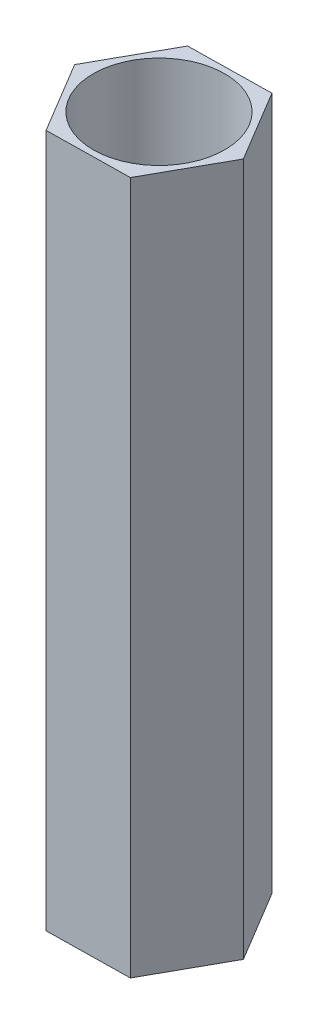
ISO-10303-21;
HEADER;
FILE_DESCRIPTION(('STEP AP214'),'2;1');
FILE_NAME('part.step','',(''),(''),'','','');
FILE_SCHEMA(('AUTOMOTIVE_DESIGN { 1 0 10303 214 1 1 1 1 }'));
ENDSEC;
DATA;
#1=APPLICATION_CONTEXT('core data for automotive mechanical design processes');
#2=APPLICATION_PROTOCOL_DEFINITION('international standard','automotive_design',2000,#1);
#3=PRODUCT_CONTEXT('',#1,'mechanical');
#4=PRODUCT('Part','Part','',(#3));
#5=PRODUCT_RELATED_PRODUCT_CATEGORY('part','',(#4));
#6=PRODUCT_DEFINITION_FORMATION('','',#4);
#7=PRODUCT_DEFINITION_CONTEXT('part definition',#1,'design');
#8=PRODUCT_DEFINITION('design','',#6,#7);
#9=PRODUCT_DEFINITION_SHAPE('','',#8);
#10=(LENGTH_UNIT() NAMED_UNIT(*) SI_UNIT(.MILLI.,.METRE.));
#11=(NAMED_UNIT(*) PLANE_ANGLE_UNIT() SI_UNIT($,.RADIAN.));
#12=(NAMED_UNIT(*) SI_UNIT($,.STERADIAN.) SOLID_ANGLE_UNIT());
#13=UNCERTAINTY_MEASURE_WITH_UNIT(LENGTH_MEASURE(1.E-05),#10,'distance_accuracy_value','');
#14=(GEOMETRIC_REPRESENTATION_CONTEXT(3) GLOBAL_UNCERTAINTY_ASSIGNED_CONTEXT((#13)) GLOBAL_UNIT_ASSIGNED_CONTEXT((#10,
#11,#12)) REPRESENTATION_CONTEXT('',''));
#15=CARTESIAN_POINT('',(0.,0.,0.));
#16=DIRECTION('',(0.,0.,1.));
#17=DIRECTION('',(1.,0.,0.));
#18=AXIS2_PLACEMENT_3D('',#15,#16,#17);
#19=CARTESIAN_POINT('',(-1.16467193353726,20.,2.09388935251219));
#20=DIRECTION('',(-0.0159887883574492,0.,-0.999872171153323));
#21=DIRECTION('',(-0.999872171153323,0.,0.0159887883574492));
#22=AXIS2_PLACEMENT_3D('',#19,#20,#21);
#23=PLANE('',#22);
#24=DIRECTION('',(0.999872171153323,0.,-0.0159887883574492));
#25=VECTOR('',#24,1.);
#26=CARTESIAN_POINT('',(-1.16467193353726,0.,2.09388935251219));
#27=LINE('',#26,#25);
#28=CARTESIAN_POINT('',(-1.16467193353726,0.,2.09388935251219));
#29=VERTEX_POINT('',#28);
#30=CARTESIAN_POINT('',(1.23102540522067,0.,2.0555801577741));
#31=VERTEX_POINT('',#30);
#32=EDGE_CURVE('E117',#29,#31,#27,.T.);
#33=ORIENTED_EDGE('',*,*,#32,.T.);
#34=DIRECTION('',(0.,-1.,0.));
#35=VECTOR('',#34,1.);
#36=CARTESIAN_POINT('',(1.23102540522067,20.,2.0555801577741));
#37=LINE('',#36,#35);
#38=CARTESIAN_POINT('',(1.23102540522067,20.,2.0555801577741));
#39=VERTEX_POINT('',#38);
#40=EDGE_CURVE('E11',#39,#31,#37,.T.);
#41=ORIENTED_EDGE('',*,*,#40,.F.);
#42=DIRECTION('',(0.999872171153323,0.,-0.0159887883574492));
#43=VECTOR('',#42,1.);
#44=CARTESIAN_POINT('',(-1.16467193353726,20.,2.09388935251219));
#45=LINE('',#44,#43);
#46=CARTESIAN_POINT('',(-1.16467193353726,20.,2.09388935251219));
#47=VERTEX_POINT('',#46);
#48=EDGE_CURVE('E128',#47,#39,#45,.T.);
#49=ORIENTED_EDGE('',*,*,#48,.F.);
#50=DIRECTION('',(0.,-1.,0.));
#51=VECTOR('',#50,1.);
#52=CARTESIAN_POINT('',(-1.16467193353726,20.,2.09388935251219));
#53=LINE('',#52,#51);
#54=EDGE_CURVE('E113',#47,#29,#53,.T.);
#55=ORIENTED_EDGE('',*,*,#54,.T.);
#56=EDGE_LOOP('',(#33,#41,#49,#55));
#57=FACE_BOUND('',#56,.T.);
#58=ADVANCED_FACE('F33',(#57),#23,.F.);
#59=CARTESIAN_POINT('',(1.23102540522067,20.,2.0555801577741));
#60=DIRECTION('',(-0.873909094934605,0.,-0.486089388683378));
#61=DIRECTION('',(-0.486089388683378,0.,0.873909094934605));
#62=AXIS2_PLACEMENT_3D('',#59,#60,#61);
#63=PLANE('',#62);
#64=DIRECTION('',(0.486089388683378,0.,-0.873909094934605));
#65=VECTOR('',#64,1.);
#66=CARTESIAN_POINT('',(1.23102540522067,0.,2.0555801577741));
#67=LINE('',#66,#65);
#68=CARTESIAN_POINT('',(2.39569733875794,0.,-0.0383091947380853));
#69=VERTEX_POINT('',#68);
#70=EDGE_CURVE('E120',#31,#69,#67,.T.);
#71=ORIENTED_EDGE('',*,*,#70,.T.);
#72=DIRECTION('',(0.,-1.,0.));
#73=VECTOR('',#72,1.);
#74=CARTESIAN_POINT('',(2.39569733875794,20.,-0.0383091947380853));
#75=LINE('',#74,#73);
#76=CARTESIAN_POINT('',(2.39569733875794,20.,-0.0383091947380853));
#77=VERTEX_POINT('',#76);
#78=EDGE_CURVE('E41',#77,#69,#75,.T.);
#79=ORIENTED_EDGE('',*,*,#78,.F.);
#80=DIRECTION('',(0.486089388683378,0.,-0.873909094934605));
#81=VECTOR('',#80,1.);
#82=CARTESIAN_POINT('',(1.23102540522067,20.,2.0555801577741));
#83=LINE('',#82,#81);
#84=EDGE_CURVE('E86',#39,#77,#83,.T.);
#85=ORIENTED_EDGE('',*,*,#84,.F.);
#86=ORIENTED_EDGE('',*,*,#40,.T.);
#87=EDGE_LOOP('',(#71,#79,#85,#86));
#88=FACE_BOUND('',#87,.T.);
#89=ADVANCED_FACE('F153',(#88),#63,.F.);
#90=CARTESIAN_POINT('',(2.39569733875794,20.,-0.0383091947380853));
#91=DIRECTION('',(-0.857920306577156,0.,0.513782782469945));
#92=DIRECTION('',(0.513782782469945,0.,0.857920306577156));
#93=AXIS2_PLACEMENT_3D('',#90,#91,#92);
#94=PLANE('',#93);
#95=DIRECTION('',(-0.513782782469945,0.,-0.857920306577156));
#96=VECTOR('',#95,1.);
#97=CARTESIAN_POINT('',(2.39569733875794,0.,-0.0383091947380853));
#98=LINE('',#97,#96);
#99=CARTESIAN_POINT('',(1.16467193353726,0.,-2.09388935251219));
#100=VERTEX_POINT('',#99);
#101=EDGE_CURVE('E123',#69,#100,#98,.T.);
#102=ORIENTED_EDGE('',*,*,#101,.T.);
#103=DIRECTION('',(0.,-1.,0.));
#104=VECTOR('',#103,1.);
#105=CARTESIAN_POINT('',(1.16467193353726,20.,-2.09388935251219));
#106=LINE('',#105,#104);
#107=CARTESIAN_POINT('',(1.16467193353726,20.,-2.09388935251219));
#108=VERTEX_POINT('',#107);
#109=EDGE_CURVE('E108',#108,#100,#106,.T.);
#110=ORIENTED_EDGE('',*,*,#109,.F.);
#111=DIRECTION('',(-0.513782782469945,0.,-0.857920306577156));
#112=VECTOR('',#111,1.);
#113=CARTESIAN_POINT('',(2.39569733875794,20.,-0.0383091947380853));
#114=LINE('',#113,#112);
#115=EDGE_CURVE('E99',#77,#108,#114,.T.);
#116=ORIENTED_EDGE('',*,*,#115,.F.);
#117=ORIENTED_EDGE('',*,*,#78,.T.);
#118=EDGE_LOOP('',(#102,#110,#116,#117));
#119=FACE_BOUND('',#118,.T.);
#120=ADVANCED_FACE('F134',(#119),#94,.F.);
#121=CARTESIAN_POINT('',(1.16467193353726,20.,-2.09388935251219));
#122=DIRECTION('',(0.015988788357449,0.,0.999872171153323));
#123=DIRECTION('',(0.999872171153323,0.,-0.015988788357449));
#124=AXIS2_PLACEMENT_3D('',#121,#122,#123);
#125=PLANE('',#124);
#126=DIRECTION('',(-0.999872171153323,0.,0.015988788357449));
#127=VECTOR('',#126,1.);
#128=CARTESIAN_POINT('',(1.16467193353726,0.,-2.09388935251219));
#129=LINE('',#128,#127);
#130=CARTESIAN_POINT('',(-1.23102540522067,0.,-2.0555801577741));
#131=VERTEX_POINT('',#130);
#132=EDGE_CURVE('E107',#100,#131,#129,.T.);
#133=ORIENTED_EDGE('',*,*,#132,.T.);
#134=DIRECTION('',(0.,-1.,0.));
#135=VECTOR('',#134,1.);
#136=CARTESIAN_POINT('',(-1.23102540522067,20.,-2.0555801577741));
#137=LINE('',#136,#135);
#138=CARTESIAN_POINT('',(-1.23102540522067,20.,-2.0555801577741));
#139=VERTEX_POINT('',#138);
#140=EDGE_CURVE('E104',#139,#131,#137,.T.);
#141=ORIENTED_EDGE('',*,*,#140,.F.);
#142=DIRECTION('',(-0.999872171153323,0.,0.015988788357449));
#143=VECTOR('',#142,1.);
#144=CARTESIAN_POINT('',(1.16467193353726,20.,-2.09388935251219));
#145=LINE('',#144,#143);
#146=EDGE_CURVE('E93',#108,#139,#145,.T.);
#147=ORIENTED_EDGE('',*,*,#146,.F.);
#148=ORIENTED_EDGE('',*,*,#109,.T.);
#149=EDGE_LOOP('',(#133,#141,#147,#148));
#150=FACE_BOUND('',#149,.T.);
#151=ADVANCED_FACE('F105',(#150),#125,.F.);
#152=CARTESIAN_POINT('',(-1.23102540522067,20.,-2.0555801577741));
#153=DIRECTION('',(0.873909094934605,0.,0.486089388683378));
#154=DIRECTION('',(0.486089388683378,0.,-0.873909094934605));
#155=AXIS2_PLACEMENT_3D('',#152,#153,#154);
#156=PLANE('',#155);
#157=DIRECTION('',(-0.486089388683378,0.,0.873909094934605));
#158=VECTOR('',#157,1.);
#159=CARTESIAN_POINT('',(-1.23102540522067,0.,-2.0555801577741));
#160=LINE('',#159,#158);
#161=CARTESIAN_POINT('',(-2.39569733875793,0.,0.0383091947380844));
#162=VERTEX_POINT('',#161);
#163=EDGE_CURVE('E72',#131,#162,#160,.T.);
#164=ORIENTED_EDGE('',*,*,#163,.T.);
#165=DIRECTION('',(0.,-1.,0.));
#166=VECTOR('',#165,1.);
#167=CARTESIAN_POINT('',(-2.39569733875793,20.,0.0383091947380844));
#168=LINE('',#167,#166);
#169=CARTESIAN_POINT('',(-2.39569733875793,20.,0.0383091947380844));
#170=VERTEX_POINT('',#169);
#171=EDGE_CURVE('E109',#170,#162,#168,.T.);
#172=ORIENTED_EDGE('',*,*,#171,.F.);
#173=DIRECTION('',(-0.486089388683378,0.,0.873909094934605));
#174=VECTOR('',#173,1.);
#175=CARTESIAN_POINT('',(-1.23102540522067,20.,-2.0555801577741));
#176=LINE('',#175,#174);
#177=EDGE_CURVE('E97',#139,#170,#176,.T.);
#178=ORIENTED_EDGE('',*,*,#177,.F.);
#179=ORIENTED_EDGE('',*,*,#140,.T.);
#180=EDGE_LOOP('',(#164,#172,#178,#179));
#181=FACE_BOUND('',#180,.T.);
#182=ADVANCED_FACE('F111',(#181),#156,.F.);
#183=CARTESIAN_POINT('',(-2.39569733875793,20.,0.0383091947380844));
#184=DIRECTION('',(0.857920306577156,0.,-0.513782782469945));
#185=DIRECTION('',(-0.513782782469945,0.,-0.857920306577156));
#186=AXIS2_PLACEMENT_3D('',#183,#184,#185);
#187=PLANE('',#186);
#188=DIRECTION('',(0.513782782469945,0.,0.857920306577156));
#189=VECTOR('',#188,1.);
#190=CARTESIAN_POINT('',(-2.39569733875793,0.,0.0383091947380844));
#191=LINE('',#190,#189);
#192=EDGE_CURVE('E78',#162,#29,#191,.T.);
#193=ORIENTED_EDGE('',*,*,#192,.T.);
#194=ORIENTED_EDGE('',*,*,#54,.F.);
#195=DIRECTION('',(0.513782782469945,0.,0.857920306577156));
#196=VECTOR('',#195,1.);
#197=CARTESIAN_POINT('',(-2.39569733875793,20.,0.0383091947380844));
#198=LINE('',#197,#196);
#199=EDGE_CURVE('E49',#170,#47,#198,.T.);
#200=ORIENTED_EDGE('',*,*,#199,.F.);
#201=ORIENTED_EDGE('',*,*,#171,.T.);
#202=EDGE_LOOP('',(#193,#194,#200,#201));
#203=FACE_BOUND('',#202,.T.);
#204=ADVANCED_FACE('F141',(#203),#187,.F.);
#205=CARTESIAN_POINT('',(0.,20.,0.));
#206=DIRECTION('',(0.,1.,0.));
#207=DIRECTION('',(0.,0.,1.));
#208=AXIS2_PLACEMENT_3D('',#205,#206,#207);
#209=PLANE('',#208);
#210=CARTESIAN_POINT('',(0.,20.,0.));
#211=DIRECTION('',(0.,1.,0.));
#212=DIRECTION('',(0.,0.,1.));
#213=AXIS2_PLACEMENT_3D('',#210,#211,#212);
#214=CIRCLE('',#213,1.9);
#215=CARTESIAN_POINT('',(0.,20.,1.9));
#216=VERTEX_POINT('',#215);
#217=EDGE_CURVE('E236',#216,#216,#214,.T.);
#218=ORIENTED_EDGE('',*,*,#217,.F.);
#219=EDGE_LOOP('',(#218));
#220=FACE_BOUND('',#219,.T.);
#221=ORIENTED_EDGE('',*,*,#48,.T.);
#222=ORIENTED_EDGE('',*,*,#84,.T.);
#223=ORIENTED_EDGE('',*,*,#115,.T.);
#224=ORIENTED_EDGE('',*,*,#146,.T.);
#225=ORIENTED_EDGE('',*,*,#177,.T.);
#226=ORIENTED_EDGE('',*,*,#199,.T.);
#227=EDGE_LOOP('',(#221,#222,#223,#224,#225,#226));
#228=FACE_BOUND('',#227,.T.);
#229=ADVANCED_FACE('F95',(#220,#228),#209,.T.);
#230=CARTESIAN_POINT('',(0.,0.,0.));
#231=DIRECTION('',(0.,1.,0.));
#232=DIRECTION('',(0.,0.,1.));
#233=AXIS2_PLACEMENT_3D('',#230,#231,#232);
#234=PLANE('',#233);
#235=CARTESIAN_POINT('',(0.,0.,0.));
#236=DIRECTION('',(0.,-1.,0.));
#237=DIRECTION('',(0.,0.,-1.));
#238=AXIS2_PLACEMENT_3D('',#235,#236,#237);
#239=CIRCLE('',#238,1.9);
#240=CARTESIAN_POINT('',(0.,0.,-1.9));
#241=VERTEX_POINT('',#240);
#242=EDGE_CURVE('E237',#241,#241,#239,.T.);
#243=ORIENTED_EDGE('',*,*,#242,.F.);
#244=EDGE_LOOP('',(#243));
#245=FACE_BOUND('',#244,.T.);
#246=ORIENTED_EDGE('',*,*,#32,.F.);
#247=ORIENTED_EDGE('',*,*,#192,.F.);
#248=ORIENTED_EDGE('',*,*,#163,.F.);
#249=ORIENTED_EDGE('',*,*,#132,.F.);
#250=ORIENTED_EDGE('',*,*,#101,.F.);
#251=ORIENTED_EDGE('',*,*,#70,.F.);
#252=EDGE_LOOP('',(#246,#247,#248,#249,#250,#251));
#253=FACE_BOUND('',#252,.T.);
#254=ADVANCED_FACE('F137',(#245,#253),#234,.F.);
#255=CARTESIAN_POINT('',(0.,12.5,0.));
#256=DIRECTION('',(0.,1.,0.));
#257=DIRECTION('',(0.,0.,1.));
#258=AXIS2_PLACEMENT_3D('',#255,#256,#257);
#259=CYLINDRICAL_SURFACE('',#258,1.9);
#260=CARTESIAN_POINT('',(0.,12.5,0.));
#261=DIRECTION('',(0.,1.,0.));
#262=DIRECTION('',(0.,0.,1.));
#263=AXIS2_PLACEMENT_3D('',#260,#261,#262);
#264=CIRCLE('',#263,1.9);
#265=CARTESIAN_POINT('',(0.,12.5,1.9));
#266=VERTEX_POINT('',#265);
#267=EDGE_CURVE('E121',#266,#266,#264,.T.);
#268=ORIENTED_EDGE('',*,*,#267,.F.);
#269=EDGE_LOOP('',(#268));
#270=FACE_BOUND('',#269,.T.);
#271=ORIENTED_EDGE('',*,*,#217,.T.);
#272=EDGE_LOOP('',(#271));
#273=FACE_BOUND('',#272,.T.);
#274=ADVANCED_FACE('F188',(#270,#273),#259,.F.);
#275=CARTESIAN_POINT('',(0.,12.5,0.));
#276=DIRECTION('',(0.,1.,0.));
#277=DIRECTION('',(0.,0.,1.));
#278=AXIS2_PLACEMENT_3D('',#275,#276,#277);
#279=PLANE('',#278);
#280=ORIENTED_EDGE('',*,*,#267,.T.);
#281=EDGE_LOOP('',(#280));
#282=FACE_BOUND('',#281,.T.);
#283=ADVANCED_FACE('F193',(#282),#279,.T.);
#284=CARTESIAN_POINT('',(0.,7.5,0.));
#285=DIRECTION('',(0.,-1.,0.));
#286=DIRECTION('',(0.,0.,-1.));
#287=AXIS2_PLACEMENT_3D('',#284,#285,#286);
#288=CYLINDRICAL_SURFACE('',#287,1.9);
#289=CARTESIAN_POINT('',(0.,7.5,0.));
#290=DIRECTION('',(0.,-1.,0.));
#291=DIRECTION('',(0.,0.,-1.));
#292=AXIS2_PLACEMENT_3D('',#289,#290,#291);
#293=CIRCLE('',#292,1.9);
#294=CARTESIAN_POINT('',(0.,7.5,-1.9));
#295=VERTEX_POINT('',#294);
#296=EDGE_CURVE('E235',#295,#295,#293,.T.);
#297=ORIENTED_EDGE('',*,*,#296,.F.);
#298=EDGE_LOOP('',(#297));
#299=FACE_BOUND('',#298,.T.);
#300=ORIENTED_EDGE('',*,*,#242,.T.);
#301=EDGE_LOOP('',(#300));
#302=FACE_BOUND('',#301,.T.);
#303=ADVANCED_FACE('F203',(#299,#302),#288,.F.);
#304=CARTESIAN_POINT('',(0.,7.5,0.));
#305=DIRECTION('',(0.,-1.,0.));
#306=DIRECTION('',(0.,0.,-1.));
#307=AXIS2_PLACEMENT_3D('',#304,#305,#306);
#308=PLANE('',#307);
#309=ORIENTED_EDGE('',*,*,#296,.T.);
#310=EDGE_LOOP('',(#309));
#311=FACE_BOUND('',#310,.T.);
#312=ADVANCED_FACE('F219',(#311),#308,.T.);
#313=CLOSED_SHELL('',(#58,#89,#120,#151,#182,#204,#229,#254,#274,#283,#303,#312));
#314=MANIFOLD_SOLID_BREP('B2',#313);
#315=ADVANCED_BREP_SHAPE_REPRESENTATION('',(#18,#314),#14);
#316=SHAPE_DEFINITION_REPRESENTATION(#9,#315);
ENDSEC;
END-ISO-10303-21;
